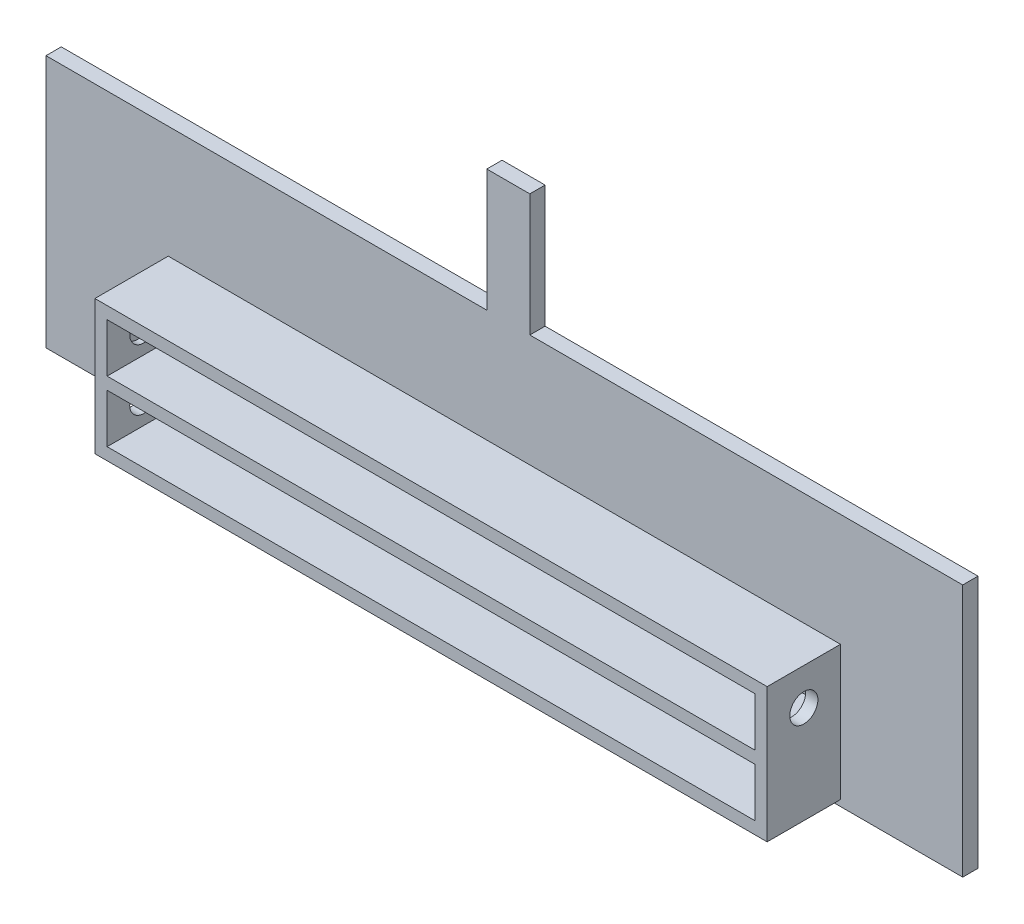
ISO-10303-21;
HEADER;
FILE_DESCRIPTION(('STEP AP214'),'2;1');
FILE_NAME('part.step','',(''),(''),'','','');
FILE_SCHEMA(('AUTOMOTIVE_DESIGN { 1 0 10303 214 1 1 1 1 }'));
ENDSEC;
DATA;
#1=APPLICATION_CONTEXT('core data for automotive mechanical design processes');
#2=APPLICATION_PROTOCOL_DEFINITION('international standard','automotive_design',2000,#1);
#3=PRODUCT_CONTEXT('',#1,'mechanical');
#4=PRODUCT('Part','Part','',(#3));
#5=PRODUCT_RELATED_PRODUCT_CATEGORY('part','',(#4));
#6=PRODUCT_DEFINITION_FORMATION('','',#4);
#7=PRODUCT_DEFINITION_CONTEXT('part definition',#1,'design');
#8=PRODUCT_DEFINITION('design','',#6,#7);
#9=PRODUCT_DEFINITION_SHAPE('','',#8);
#10=(LENGTH_UNIT() NAMED_UNIT(*) SI_UNIT(.MILLI.,.METRE.));
#11=(NAMED_UNIT(*) PLANE_ANGLE_UNIT() SI_UNIT($,.RADIAN.));
#12=(NAMED_UNIT(*) SI_UNIT($,.STERADIAN.) SOLID_ANGLE_UNIT());
#13=UNCERTAINTY_MEASURE_WITH_UNIT(LENGTH_MEASURE(1.E-05),#10,'distance_accuracy_value','');
#14=(GEOMETRIC_REPRESENTATION_CONTEXT(3) GLOBAL_UNCERTAINTY_ASSIGNED_CONTEXT((#13)) GLOBAL_UNIT_ASSIGNED_CONTEXT((#10,
#11,#12)) REPRESENTATION_CONTEXT('',''));
#15=CARTESIAN_POINT('',(0.,0.,0.));
#16=DIRECTION('',(0.,0.,1.));
#17=DIRECTION('',(1.,0.,0.));
#18=AXIS2_PLACEMENT_3D('',#15,#16,#17);
#19=CARTESIAN_POINT('',(-75.,29.41,2.5));
#20=DIRECTION('',(0.,-1.,0.));
#21=DIRECTION('',(0.,0.,-1.));
#22=AXIS2_PLACEMENT_3D('',#19,#20,#21);
#23=PLANE('',#22);
#24=DIRECTION('',(0.,0.,1.));
#25=VECTOR('',#24,1.);
#26=CARTESIAN_POINT('',(-2.87482082794567,29.41,0.));
#27=LINE('',#26,#25);
#28=CARTESIAN_POINT('',(-2.87482082794567,29.41,0.));
#29=VERTEX_POINT('',#28);
#30=CARTESIAN_POINT('',(-2.87482082794567,29.41,2.5));
#31=VERTEX_POINT('',#30);
#32=EDGE_CURVE('E196',#29,#31,#27,.T.);
#33=ORIENTED_EDGE('',*,*,#32,.F.);
#34=DIRECTION('',(-1.,0.,0.));
#35=VECTOR('',#34,1.);
#36=CARTESIAN_POINT('',(-75.,29.41,0.));
#37=LINE('',#36,#35);
#38=CARTESIAN_POINT('',(-75.,29.41,0.));
#39=VERTEX_POINT('',#38);
#40=EDGE_CURVE('E327',#29,#39,#37,.T.);
#41=ORIENTED_EDGE('',*,*,#40,.T.);
#42=DIRECTION('',(0.,0.,-1.));
#43=VECTOR('',#42,1.);
#44=CARTESIAN_POINT('',(-75.,29.41,2.5));
#45=LINE('',#44,#43);
#46=CARTESIAN_POINT('',(-75.,29.41,2.5));
#47=VERTEX_POINT('',#46);
#48=EDGE_CURVE('E320',#47,#39,#45,.T.);
#49=ORIENTED_EDGE('',*,*,#48,.F.);
#50=DIRECTION('',(-1.,0.,0.));
#51=VECTOR('',#50,1.);
#52=CARTESIAN_POINT('',(-75.,29.41,2.5));
#53=LINE('',#52,#51);
#54=EDGE_CURVE('E50',#31,#47,#53,.T.);
#55=ORIENTED_EDGE('',*,*,#54,.F.);
#56=EDGE_LOOP('',(#33,#41,#49,#55));
#57=FACE_BOUND('',#56,.T.);
#58=ADVANCED_FACE('F33',(#57),#23,.F.);
#59=DIRECTION('',(0.,0.,-1.));
#60=VECTOR('',#59,1.);
#61=CARTESIAN_POINT('',(4.16522285933797,29.41,0.));
#62=LINE('',#61,#60);
#63=CARTESIAN_POINT('',(4.16522285933797,29.41,2.5));
#64=VERTEX_POINT('',#63);
#65=CARTESIAN_POINT('',(4.16522285933797,29.41,0.));
#66=VERTEX_POINT('',#65);
#67=EDGE_CURVE('E58',#64,#66,#62,.T.);
#68=ORIENTED_EDGE('',*,*,#67,.F.);
#69=CARTESIAN_POINT('',(75.,29.41,2.5));
#70=VERTEX_POINT('',#69);
#71=EDGE_CURVE('E318',#70,#64,#53,.T.);
#72=ORIENTED_EDGE('',*,*,#71,.F.);
#73=DIRECTION('',(0.,0.,-1.));
#74=VECTOR('',#73,1.);
#75=CARTESIAN_POINT('',(75.,29.41,2.5));
#76=LINE('',#75,#74);
#77=CARTESIAN_POINT('',(75.,29.41,0.));
#78=VERTEX_POINT('',#77);
#79=EDGE_CURVE('E331',#70,#78,#76,.T.);
#80=ORIENTED_EDGE('',*,*,#79,.T.);
#81=EDGE_CURVE('E314',#78,#66,#37,.T.);
#82=ORIENTED_EDGE('',*,*,#81,.T.);
#83=EDGE_LOOP('',(#68,#72,#80,#82));
#84=FACE_BOUND('',#83,.T.);
#85=ADVANCED_FACE('F381',(#84),#23,.F.);
#86=CARTESIAN_POINT('',(0.,0.,14.5));
#87=DIRECTION('',(0.,0.,1.));
#88=DIRECTION('',(1.,0.,0.));
#89=AXIS2_PLACEMENT_3D('',#86,#87,#88);
#90=PLANE('',#89);
#91=DIRECTION('',(0.,-1.,0.));
#92=VECTOR('',#91,1.);
#93=CARTESIAN_POINT('',(-55.,11.,14.5));
#94=LINE('',#93,#92);
#95=CARTESIAN_POINT('',(-55.,11.,14.5));
#96=VERTEX_POINT('',#95);
#97=CARTESIAN_POINT('',(-55.,-11.,14.5));
#98=VERTEX_POINT('',#97);
#99=EDGE_CURVE('E282',#96,#98,#94,.T.);
#100=ORIENTED_EDGE('',*,*,#99,.T.);
#101=DIRECTION('',(1.,0.,0.));
#102=VECTOR('',#101,1.);
#103=CARTESIAN_POINT('',(-55.,-11.,14.5));
#104=LINE('',#103,#102);
#105=CARTESIAN_POINT('',(55.,-11.,14.5));
#106=VERTEX_POINT('',#105);
#107=EDGE_CURVE('E285',#98,#106,#104,.T.);
#108=ORIENTED_EDGE('',*,*,#107,.T.);
#109=DIRECTION('',(0.,1.,0.));
#110=VECTOR('',#109,1.);
#111=CARTESIAN_POINT('',(55.,11.,14.5));
#112=LINE('',#111,#110);
#113=CARTESIAN_POINT('',(55.,11.,14.5));
#114=VERTEX_POINT('',#113);
#115=EDGE_CURVE('E288',#106,#114,#112,.T.);
#116=ORIENTED_EDGE('',*,*,#115,.T.);
#117=DIRECTION('',(-1.,0.,0.));
#118=VECTOR('',#117,1.);
#119=CARTESIAN_POINT('',(-55.,11.,14.5));
#120=LINE('',#119,#118);
#121=EDGE_CURVE('E290',#114,#96,#120,.T.);
#122=ORIENTED_EDGE('',*,*,#121,.T.);
#123=EDGE_LOOP('',(#100,#108,#116,#122));
#124=FACE_BOUND('',#123,.T.);
#125=DIRECTION('',(1.,0.,0.));
#126=VECTOR('',#125,1.);
#127=CARTESIAN_POINT('',(-53.,-9.,14.5));
#128=LINE('',#127,#126);
#129=CARTESIAN_POINT('',(-53.,-9.,14.5));
#130=VERTEX_POINT('',#129);
#131=CARTESIAN_POINT('',(53.,-9.,14.5));
#132=VERTEX_POINT('',#131);
#133=EDGE_CURVE('E256',#130,#132,#128,.T.);
#134=ORIENTED_EDGE('',*,*,#133,.F.);
#135=DIRECTION('',(0.,-1.,0.));
#136=VECTOR('',#135,1.);
#137=CARTESIAN_POINT('',(-53.,-1.,14.5));
#138=LINE('',#137,#136);
#139=CARTESIAN_POINT('',(-53.,-1.,14.5));
#140=VERTEX_POINT('',#139);
#141=EDGE_CURVE('E254',#140,#130,#138,.T.);
#142=ORIENTED_EDGE('',*,*,#141,.F.);
#143=DIRECTION('',(-1.,0.,0.));
#144=VECTOR('',#143,1.);
#145=CARTESIAN_POINT('',(-53.,-1.,14.5));
#146=LINE('',#145,#144);
#147=CARTESIAN_POINT('',(53.,-1.,14.5));
#148=VERTEX_POINT('',#147);
#149=EDGE_CURVE('E262',#148,#140,#146,.T.);
#150=ORIENTED_EDGE('',*,*,#149,.F.);
#151=DIRECTION('',(0.,1.,0.));
#152=VECTOR('',#151,1.);
#153=CARTESIAN_POINT('',(53.,-1.,14.5));
#154=LINE('',#153,#152);
#155=EDGE_CURVE('E259',#132,#148,#154,.T.);
#156=ORIENTED_EDGE('',*,*,#155,.F.);
#157=EDGE_LOOP('',(#134,#142,#150,#156));
#158=FACE_BOUND('',#157,.T.);
#159=DIRECTION('',(1.,0.,0.));
#160=VECTOR('',#159,1.);
#161=CARTESIAN_POINT('',(-53.,1.,14.5));
#162=LINE('',#161,#160);
#163=CARTESIAN_POINT('',(-53.,1.,14.5));
#164=VERTEX_POINT('',#163);
#165=CARTESIAN_POINT('',(53.,1.,14.5));
#166=VERTEX_POINT('',#165);
#167=EDGE_CURVE('E224',#164,#166,#162,.T.);
#168=ORIENTED_EDGE('',*,*,#167,.F.);
#169=DIRECTION('',(0.,-1.,0.));
#170=VECTOR('',#169,1.);
#171=CARTESIAN_POINT('',(-53.,9.,14.5));
#172=LINE('',#171,#170);
#173=CARTESIAN_POINT('',(-53.,9.,14.5));
#174=VERTEX_POINT('',#173);
#175=EDGE_CURVE('E222',#174,#164,#172,.T.);
#176=ORIENTED_EDGE('',*,*,#175,.F.);
#177=DIRECTION('',(-1.,0.,0.));
#178=VECTOR('',#177,1.);
#179=CARTESIAN_POINT('',(-53.,9.,14.5));
#180=LINE('',#179,#178);
#181=CARTESIAN_POINT('',(53.,9.,14.5));
#182=VERTEX_POINT('',#181);
#183=EDGE_CURVE('E230',#182,#174,#180,.T.);
#184=ORIENTED_EDGE('',*,*,#183,.F.);
#185=DIRECTION('',(0.,1.,0.));
#186=VECTOR('',#185,1.);
#187=CARTESIAN_POINT('',(53.,9.,14.5));
#188=LINE('',#187,#186);
#189=EDGE_CURVE('E227',#166,#182,#188,.T.);
#190=ORIENTED_EDGE('',*,*,#189,.F.);
#191=EDGE_LOOP('',(#168,#176,#184,#190));
#192=FACE_BOUND('',#191,.T.);
#193=ADVANCED_FACE('F359',(#124,#158,#192),#90,.T.);
#194=CARTESIAN_POINT('',(0.,0.,2.5));
#195=DIRECTION('',(0.,0.,1.));
#196=DIRECTION('',(1.,0.,0.));
#197=AXIS2_PLACEMENT_3D('',#194,#195,#196);
#198=PLANE('',#197);
#199=DIRECTION('',(0.,-1.,0.));
#200=VECTOR('',#199,1.);
#201=CARTESIAN_POINT('',(-75.,29.41,2.5));
#202=LINE('',#201,#200);
#203=CARTESIAN_POINT('',(-75.,-12.,2.5));
#204=VERTEX_POINT('',#203);
#205=EDGE_CURVE('E311',#47,#204,#202,.T.);
#206=ORIENTED_EDGE('',*,*,#205,.T.);
#207=DIRECTION('',(1.,0.,0.));
#208=VECTOR('',#207,1.);
#209=CARTESIAN_POINT('',(-75.,-12.,2.5));
#210=LINE('',#209,#208);
#211=CARTESIAN_POINT('',(75.,-12.,2.5));
#212=VERTEX_POINT('',#211);
#213=EDGE_CURVE('E313',#204,#212,#210,.T.);
#214=ORIENTED_EDGE('',*,*,#213,.T.);
#215=DIRECTION('',(0.,1.,0.));
#216=VECTOR('',#215,1.);
#217=CARTESIAN_POINT('',(75.,29.41,2.5));
#218=LINE('',#217,#216);
#219=EDGE_CURVE('E316',#212,#70,#218,.T.);
#220=ORIENTED_EDGE('',*,*,#219,.T.);
#221=ORIENTED_EDGE('',*,*,#71,.T.);
#222=DIRECTION('',(0.,-1.,0.));
#223=VECTOR('',#222,1.);
#224=CARTESIAN_POINT('',(4.16522285933797,49.41,2.5));
#225=LINE('',#224,#223);
#226=CARTESIAN_POINT('',(4.16522285933797,49.41,2.5));
#227=VERTEX_POINT('',#226);
#228=EDGE_CURVE('E181',#227,#64,#225,.T.);
#229=ORIENTED_EDGE('',*,*,#228,.F.);
#230=DIRECTION('',(1.,0.,0.));
#231=VECTOR('',#230,1.);
#232=CARTESIAN_POINT('',(-2.87482082794567,49.41,2.5));
#233=LINE('',#232,#231);
#234=CARTESIAN_POINT('',(-2.87482082794567,49.41,2.5));
#235=VERTEX_POINT('',#234);
#236=EDGE_CURVE('E172',#235,#227,#233,.T.);
#237=ORIENTED_EDGE('',*,*,#236,.F.);
#238=DIRECTION('',(0.,-1.,0.));
#239=VECTOR('',#238,1.);
#240=CARTESIAN_POINT('',(-2.87482082794567,49.41,2.5));
#241=LINE('',#240,#239);
#242=EDGE_CURVE('E178',#235,#31,#241,.T.);
#243=ORIENTED_EDGE('',*,*,#242,.T.);
#244=ORIENTED_EDGE('',*,*,#54,.T.);
#245=EDGE_LOOP('',(#206,#214,#220,#221,#229,#237,#243,#244));
#246=FACE_BOUND('',#245,.T.);
#247=DIRECTION('',(1.,0.,0.));
#248=VECTOR('',#247,1.);
#249=CARTESIAN_POINT('',(-55.,-11.,2.5));
#250=LINE('',#249,#248);
#251=CARTESIAN_POINT('',(-55.,-11.,2.5));
#252=VERTEX_POINT('',#251);
#253=CARTESIAN_POINT('',(55.,-11.,2.5));
#254=VERTEX_POINT('',#253);
#255=EDGE_CURVE('E295',#252,#254,#250,.T.);
#256=ORIENTED_EDGE('',*,*,#255,.F.);
#257=DIRECTION('',(0.,-1.,0.));
#258=VECTOR('',#257,1.);
#259=CARTESIAN_POINT('',(-55.,11.,2.5));
#260=LINE('',#259,#258);
#261=CARTESIAN_POINT('',(-55.,11.,2.5));
#262=VERTEX_POINT('',#261);
#263=EDGE_CURVE('E253',#262,#252,#260,.T.);
#264=ORIENTED_EDGE('',*,*,#263,.F.);
#265=DIRECTION('',(-1.,0.,0.));
#266=VECTOR('',#265,1.);
#267=CARTESIAN_POINT('',(-55.,11.,2.5));
#268=LINE('',#267,#266);
#269=CARTESIAN_POINT('',(55.,11.,2.5));
#270=VERTEX_POINT('',#269);
#271=EDGE_CURVE('E286',#270,#262,#268,.T.);
#272=ORIENTED_EDGE('',*,*,#271,.F.);
#273=DIRECTION('',(0.,1.,0.));
#274=VECTOR('',#273,1.);
#275=CARTESIAN_POINT('',(55.,11.,2.5));
#276=LINE('',#275,#274);
#277=EDGE_CURVE('E297',#254,#270,#276,.T.);
#278=ORIENTED_EDGE('',*,*,#277,.F.);
#279=EDGE_LOOP('',(#256,#264,#272,#278));
#280=FACE_BOUND('',#279,.T.);
#281=ADVANCED_FACE('F175',(#246,#280),#198,.T.);
#282=CARTESIAN_POINT('',(-75.,29.41,2.5));
#283=DIRECTION('',(1.,0.,0.));
#284=DIRECTION('',(0.,0.,-1.));
#285=AXIS2_PLACEMENT_3D('',#282,#283,#284);
#286=PLANE('',#285);
#287=DIRECTION('',(0.,-1.,0.));
#288=VECTOR('',#287,1.);
#289=CARTESIAN_POINT('',(-75.,29.41,0.));
#290=LINE('',#289,#288);
#291=CARTESIAN_POINT('',(-75.,-12.,0.));
#292=VERTEX_POINT('',#291);
#293=EDGE_CURVE('E310',#39,#292,#290,.T.);
#294=ORIENTED_EDGE('',*,*,#293,.T.);
#295=DIRECTION('',(0.,0.,-1.));
#296=VECTOR('',#295,1.);
#297=CARTESIAN_POINT('',(-75.,-12.,2.5));
#298=LINE('',#297,#296);
#299=EDGE_CURVE('E11',#204,#292,#298,.T.);
#300=ORIENTED_EDGE('',*,*,#299,.F.);
#301=ORIENTED_EDGE('',*,*,#205,.F.);
#302=ORIENTED_EDGE('',*,*,#48,.T.);
#303=EDGE_LOOP('',(#294,#300,#301,#302));
#304=FACE_BOUND('',#303,.T.);
#305=ADVANCED_FACE('F35',(#304),#286,.F.);
#306=CARTESIAN_POINT('',(-75.,-12.,2.5));
#307=DIRECTION('',(0.,1.,0.));
#308=DIRECTION('',(0.,0.,1.));
#309=AXIS2_PLACEMENT_3D('',#306,#307,#308);
#310=PLANE('',#309);
#311=DIRECTION('',(1.,0.,0.));
#312=VECTOR('',#311,1.);
#313=CARTESIAN_POINT('',(-75.,-12.,0.));
#314=LINE('',#313,#312);
#315=CARTESIAN_POINT('',(75.,-12.,0.));
#316=VERTEX_POINT('',#315);
#317=EDGE_CURVE('E323',#292,#316,#314,.T.);
#318=ORIENTED_EDGE('',*,*,#317,.T.);
#319=DIRECTION('',(0.,0.,-1.));
#320=VECTOR('',#319,1.);
#321=CARTESIAN_POINT('',(75.,-12.,2.5));
#322=LINE('',#321,#320);
#323=EDGE_CURVE('E42',#212,#316,#322,.T.);
#324=ORIENTED_EDGE('',*,*,#323,.F.);
#325=ORIENTED_EDGE('',*,*,#213,.F.);
#326=ORIENTED_EDGE('',*,*,#299,.T.);
#327=EDGE_LOOP('',(#318,#324,#325,#326));
#328=FACE_BOUND('',#327,.T.);
#329=ADVANCED_FACE('F393',(#328),#310,.F.);
#330=CARTESIAN_POINT('',(75.,29.41,2.5));
#331=DIRECTION('',(-1.,0.,0.));
#332=DIRECTION('',(0.,0.,1.));
#333=AXIS2_PLACEMENT_3D('',#330,#331,#332);
#334=PLANE('',#333);
#335=DIRECTION('',(0.,1.,0.));
#336=VECTOR('',#335,1.);
#337=CARTESIAN_POINT('',(75.,29.41,0.));
#338=LINE('',#337,#336);
#339=EDGE_CURVE('E325',#316,#78,#338,.T.);
#340=ORIENTED_EDGE('',*,*,#339,.T.);
#341=ORIENTED_EDGE('',*,*,#79,.F.);
#342=ORIENTED_EDGE('',*,*,#219,.F.);
#343=ORIENTED_EDGE('',*,*,#323,.T.);
#344=EDGE_LOOP('',(#340,#341,#342,#343));
#345=FACE_BOUND('',#344,.T.);
#346=ADVANCED_FACE('F391',(#345),#334,.F.);
#347=CARTESIAN_POINT('',(0.,0.,0.));
#348=DIRECTION('',(0.,0.,1.));
#349=DIRECTION('',(1.,0.,0.));
#350=AXIS2_PLACEMENT_3D('',#347,#348,#349);
#351=PLANE('',#350);
#352=ORIENTED_EDGE('',*,*,#293,.F.);
#353=ORIENTED_EDGE('',*,*,#40,.F.);
#354=DIRECTION('',(0.,-1.,0.));
#355=VECTOR('',#354,1.);
#356=CARTESIAN_POINT('',(-2.87482082794567,49.41,0.));
#357=LINE('',#356,#355);
#358=CARTESIAN_POINT('',(-2.87482082794567,49.41,0.));
#359=VERTEX_POINT('',#358);
#360=EDGE_CURVE('E417',#359,#29,#357,.T.);
#361=ORIENTED_EDGE('',*,*,#360,.F.);
#362=DIRECTION('',(-1.,0.,0.));
#363=VECTOR('',#362,1.);
#364=CARTESIAN_POINT('',(-2.87482082794567,49.41,0.));
#365=LINE('',#364,#363);
#366=CARTESIAN_POINT('',(4.16522285933797,49.41,0.));
#367=VERTEX_POINT('',#366);
#368=EDGE_CURVE('E190',#367,#359,#365,.T.);
#369=ORIENTED_EDGE('',*,*,#368,.F.);
#370=DIRECTION('',(0.,-1.,0.));
#371=VECTOR('',#370,1.);
#372=CARTESIAN_POINT('',(4.16522285933797,49.41,0.));
#373=LINE('',#372,#371);
#374=EDGE_CURVE('E202',#367,#66,#373,.T.);
#375=ORIENTED_EDGE('',*,*,#374,.T.);
#376=ORIENTED_EDGE('',*,*,#81,.F.);
#377=ORIENTED_EDGE('',*,*,#339,.F.);
#378=ORIENTED_EDGE('',*,*,#317,.F.);
#379=EDGE_LOOP('',(#352,#353,#361,#369,#375,#376,#377,#378));
#380=FACE_BOUND('',#379,.T.);
#381=ADVANCED_FACE('F389',(#380),#351,.F.);
#382=CARTESIAN_POINT('',(-55.,11.,14.5));
#383=DIRECTION('',(1.,0.,0.));
#384=DIRECTION('',(0.,0.,-1.));
#385=AXIS2_PLACEMENT_3D('',#382,#383,#384);
#386=PLANE('',#385);
#387=CARTESIAN_POINT('',(-55.,-4.99999999999999,8.5));
#388=DIRECTION('',(-1.,0.,0.));
#389=DIRECTION('',(0.,0.,1.));
#390=AXIS2_PLACEMENT_3D('',#387,#388,#389);
#391=CIRCLE('',#390,2.3);
#392=CARTESIAN_POINT('',(-55.,-4.99999999999999,10.8));
#393=VERTEX_POINT('',#392);
#394=EDGE_CURVE('E211',#393,#393,#391,.T.);
#395=ORIENTED_EDGE('',*,*,#394,.F.);
#396=EDGE_LOOP('',(#395));
#397=FACE_BOUND('',#396,.T.);
#398=ORIENTED_EDGE('',*,*,#263,.T.);
#399=DIRECTION('',(0.,0.,-1.));
#400=VECTOR('',#399,1.);
#401=CARTESIAN_POINT('',(-55.,-11.,14.5));
#402=LINE('',#401,#400);
#403=EDGE_CURVE('E308',#98,#252,#402,.T.);
#404=ORIENTED_EDGE('',*,*,#403,.F.);
#405=ORIENTED_EDGE('',*,*,#99,.F.);
#406=DIRECTION('',(0.,0.,-1.));
#407=VECTOR('',#406,1.);
#408=CARTESIAN_POINT('',(-55.,11.,14.5));
#409=LINE('',#408,#407);
#410=EDGE_CURVE('E292',#96,#262,#409,.T.);
#411=ORIENTED_EDGE('',*,*,#410,.T.);
#412=EDGE_LOOP('',(#398,#404,#405,#411));
#413=FACE_BOUND('',#412,.T.);
#414=ADVANCED_FACE('F546',(#397,#413),#386,.F.);
#415=CARTESIAN_POINT('',(-55.,-11.,14.5));
#416=DIRECTION('',(0.,1.,0.));
#417=DIRECTION('',(-1.,0.,0.));
#418=AXIS2_PLACEMENT_3D('',#415,#416,#417);
#419=PLANE('',#418);
#420=ORIENTED_EDGE('',*,*,#255,.T.);
#421=DIRECTION('',(0.,0.,-1.));
#422=VECTOR('',#421,1.);
#423=CARTESIAN_POINT('',(55.,-11.,14.5));
#424=LINE('',#423,#422);
#425=EDGE_CURVE('E305',#106,#254,#424,.T.);
#426=ORIENTED_EDGE('',*,*,#425,.F.);
#427=ORIENTED_EDGE('',*,*,#107,.F.);
#428=ORIENTED_EDGE('',*,*,#403,.T.);
#429=EDGE_LOOP('',(#420,#426,#427,#428));
#430=FACE_BOUND('',#429,.T.);
#431=ADVANCED_FACE('F581',(#430),#419,.F.);
#432=CARTESIAN_POINT('',(55.,11.,14.5));
#433=DIRECTION('',(-1.,0.,0.));
#434=DIRECTION('',(0.,0.,1.));
#435=AXIS2_PLACEMENT_3D('',#432,#433,#434);
#436=PLANE('',#435);
#437=CARTESIAN_POINT('',(55.,5.,8.5));
#438=DIRECTION('',(1.,0.,0.));
#439=DIRECTION('',(0.,0.,-1.));
#440=AXIS2_PLACEMENT_3D('',#437,#438,#439);
#441=CIRCLE('',#440,2.3);
#442=CARTESIAN_POINT('',(55.,5.,6.2));
#443=VERTEX_POINT('',#442);
#444=EDGE_CURVE('E197',#443,#443,#441,.T.);
#445=ORIENTED_EDGE('',*,*,#444,.F.);
#446=EDGE_LOOP('',(#445));
#447=FACE_BOUND('',#446,.T.);
#448=ORIENTED_EDGE('',*,*,#277,.T.);
#449=DIRECTION('',(0.,0.,-1.));
#450=VECTOR('',#449,1.);
#451=CARTESIAN_POINT('',(55.,11.,14.5));
#452=LINE('',#451,#450);
#453=EDGE_CURVE('E303',#114,#270,#452,.T.);
#454=ORIENTED_EDGE('',*,*,#453,.F.);
#455=ORIENTED_EDGE('',*,*,#115,.F.);
#456=ORIENTED_EDGE('',*,*,#425,.T.);
#457=EDGE_LOOP('',(#448,#454,#455,#456));
#458=FACE_BOUND('',#457,.T.);
#459=ADVANCED_FACE('F375',(#447,#458),#436,.F.);
#460=CARTESIAN_POINT('',(-55.,11.,14.5));
#461=DIRECTION('',(0.,-1.,0.));
#462=DIRECTION('',(0.,0.,-1.));
#463=AXIS2_PLACEMENT_3D('',#460,#461,#462);
#464=PLANE('',#463);
#465=ORIENTED_EDGE('',*,*,#271,.T.);
#466=ORIENTED_EDGE('',*,*,#410,.F.);
#467=ORIENTED_EDGE('',*,*,#121,.F.);
#468=ORIENTED_EDGE('',*,*,#453,.T.);
#469=EDGE_LOOP('',(#465,#466,#467,#468));
#470=FACE_BOUND('',#469,.T.);
#471=ADVANCED_FACE('F367',(#470),#464,.F.);
#472=CARTESIAN_POINT('',(-53.,-1.,14.5));
#473=DIRECTION('',(1.,0.,0.));
#474=DIRECTION('',(0.,0.,-1.));
#475=AXIS2_PLACEMENT_3D('',#472,#473,#474);
#476=PLANE('',#475);
#477=CARTESIAN_POINT('',(-53.,-4.99999999999999,8.5));
#478=DIRECTION('',(1.,0.,0.));
#479=DIRECTION('',(0.,0.,-1.));
#480=AXIS2_PLACEMENT_3D('',#477,#478,#479);
#481=CIRCLE('',#480,2.3);
#482=CARTESIAN_POINT('',(-53.,-4.99999999999999,6.2));
#483=VERTEX_POINT('',#482);
#484=EDGE_CURVE('E218',#483,#483,#481,.T.);
#485=ORIENTED_EDGE('',*,*,#484,.F.);
#486=EDGE_LOOP('',(#485));
#487=FACE_BOUND('',#486,.T.);
#488=DIRECTION('',(0.,-1.,0.));
#489=VECTOR('',#488,1.);
#490=CARTESIAN_POINT('',(-53.,-1.,2.5));
#491=LINE('',#490,#489);
#492=CARTESIAN_POINT('',(-53.,-1.,2.5));
#493=VERTEX_POINT('',#492);
#494=CARTESIAN_POINT('',(-53.,-9.,2.5));
#495=VERTEX_POINT('',#494);
#496=EDGE_CURVE('E221',#493,#495,#491,.T.);
#497=ORIENTED_EDGE('',*,*,#496,.F.);
#498=DIRECTION('',(0.,0.,-1.));
#499=VECTOR('',#498,1.);
#500=CARTESIAN_POINT('',(-53.,-1.,14.5));
#501=LINE('',#500,#499);
#502=EDGE_CURVE('E264',#140,#493,#501,.T.);
#503=ORIENTED_EDGE('',*,*,#502,.F.);
#504=ORIENTED_EDGE('',*,*,#141,.T.);
#505=DIRECTION('',(0.,0.,-1.));
#506=VECTOR('',#505,1.);
#507=CARTESIAN_POINT('',(-53.,-9.,14.5));
#508=LINE('',#507,#506);
#509=EDGE_CURVE('E237',#130,#495,#508,.T.);
#510=ORIENTED_EDGE('',*,*,#509,.T.);
#511=EDGE_LOOP('',(#497,#503,#504,#510));
#512=FACE_BOUND('',#511,.T.);
#513=ADVANCED_FACE('F365',(#487,#512),#476,.T.);
#514=CARTESIAN_POINT('',(-53.,-9.,14.5));
#515=DIRECTION('',(0.,1.,0.));
#516=DIRECTION('',(0.,0.,1.));
#517=AXIS2_PLACEMENT_3D('',#514,#515,#516);
#518=PLANE('',#517);
#519=DIRECTION('',(1.,0.,0.));
#520=VECTOR('',#519,1.);
#521=CARTESIAN_POINT('',(-53.,-9.,2.5));
#522=LINE('',#521,#520);
#523=CARTESIAN_POINT('',(53.,-9.,2.5));
#524=VERTEX_POINT('',#523);
#525=EDGE_CURVE('E267',#495,#524,#522,.T.);
#526=ORIENTED_EDGE('',*,*,#525,.F.);
#527=ORIENTED_EDGE('',*,*,#509,.F.);
#528=ORIENTED_EDGE('',*,*,#133,.T.);
#529=DIRECTION('',(0.,0.,-1.));
#530=VECTOR('',#529,1.);
#531=CARTESIAN_POINT('',(53.,-9.,14.5));
#532=LINE('',#531,#530);
#533=EDGE_CURVE('E277',#132,#524,#532,.T.);
#534=ORIENTED_EDGE('',*,*,#533,.T.);
#535=EDGE_LOOP('',(#526,#527,#528,#534));
#536=FACE_BOUND('',#535,.T.);
#537=ADVANCED_FACE('F345',(#536),#518,.T.);
#538=CARTESIAN_POINT('',(53.,-1.,14.5));
#539=DIRECTION('',(-1.,0.,0.));
#540=DIRECTION('',(0.,0.,1.));
#541=AXIS2_PLACEMENT_3D('',#538,#539,#540);
#542=PLANE('',#541);
#543=CARTESIAN_POINT('',(53.,-4.99999999999999,8.5));
#544=DIRECTION('',(-1.,0.,0.));
#545=DIRECTION('',(0.,0.,1.));
#546=AXIS2_PLACEMENT_3D('',#543,#544,#545);
#547=CIRCLE('',#546,2.3);
#548=CARTESIAN_POINT('',(53.,-4.99999999999999,10.8));
#549=VERTEX_POINT('',#548);
#550=EDGE_CURVE('E215',#549,#549,#547,.T.);
#551=ORIENTED_EDGE('',*,*,#550,.F.);
#552=EDGE_LOOP('',(#551));
#553=FACE_BOUND('',#552,.T.);
#554=DIRECTION('',(0.,1.,0.));
#555=VECTOR('',#554,1.);
#556=CARTESIAN_POINT('',(53.,-1.,2.5));
#557=LINE('',#556,#555);
#558=CARTESIAN_POINT('',(53.,-1.,2.5));
#559=VERTEX_POINT('',#558);
#560=EDGE_CURVE('E269',#524,#559,#557,.T.);
#561=ORIENTED_EDGE('',*,*,#560,.F.);
#562=ORIENTED_EDGE('',*,*,#533,.F.);
#563=ORIENTED_EDGE('',*,*,#155,.T.);
#564=DIRECTION('',(0.,0.,-1.));
#565=VECTOR('',#564,1.);
#566=CARTESIAN_POINT('',(53.,-1.,14.5));
#567=LINE('',#566,#565);
#568=EDGE_CURVE('E274',#148,#559,#567,.T.);
#569=ORIENTED_EDGE('',*,*,#568,.T.);
#570=EDGE_LOOP('',(#561,#562,#563,#569));
#571=FACE_BOUND('',#570,.T.);
#572=ADVANCED_FACE('F341',(#553,#571),#542,.T.);
#573=CARTESIAN_POINT('',(-53.,-1.,14.5));
#574=DIRECTION('',(0.,-1.,0.));
#575=DIRECTION('',(0.,0.,-1.));
#576=AXIS2_PLACEMENT_3D('',#573,#574,#575);
#577=PLANE('',#576);
#578=DIRECTION('',(-1.,0.,0.));
#579=VECTOR('',#578,1.);
#580=CARTESIAN_POINT('',(-53.,-1.,2.5));
#581=LINE('',#580,#579);
#582=EDGE_CURVE('E257',#559,#493,#581,.T.);
#583=ORIENTED_EDGE('',*,*,#582,.F.);
#584=ORIENTED_EDGE('',*,*,#568,.F.);
#585=ORIENTED_EDGE('',*,*,#149,.T.);
#586=ORIENTED_EDGE('',*,*,#502,.T.);
#587=EDGE_LOOP('',(#583,#584,#585,#586));
#588=FACE_BOUND('',#587,.T.);
#589=ADVANCED_FACE('F344',(#588),#577,.T.);
#590=CARTESIAN_POINT('',(0.,0.,2.5));
#591=DIRECTION('',(0.,0.,1.));
#592=DIRECTION('',(1.,0.,0.));
#593=AXIS2_PLACEMENT_3D('',#590,#591,#592);
#594=PLANE('',#593);
#595=ORIENTED_EDGE('',*,*,#496,.T.);
#596=ORIENTED_EDGE('',*,*,#525,.T.);
#597=ORIENTED_EDGE('',*,*,#560,.T.);
#598=ORIENTED_EDGE('',*,*,#582,.T.);
#599=EDGE_LOOP('',(#595,#596,#597,#598));
#600=FACE_BOUND('',#599,.T.);
#601=ADVANCED_FACE('F352',(#600),#594,.T.);
#602=CARTESIAN_POINT('',(-53.,9.,14.5));
#603=DIRECTION('',(1.,0.,0.));
#604=DIRECTION('',(0.,0.,-1.));
#605=AXIS2_PLACEMENT_3D('',#602,#603,#604);
#606=PLANE('',#605);
#607=CARTESIAN_POINT('',(-53.,5.,8.5));
#608=DIRECTION('',(1.,0.,0.));
#609=DIRECTION('',(0.,0.,-1.));
#610=AXIS2_PLACEMENT_3D('',#607,#608,#609);
#611=CIRCLE('',#610,2.3);
#612=CARTESIAN_POINT('',(-53.,5.,6.2));
#613=VERTEX_POINT('',#612);
#614=EDGE_CURVE('E208',#613,#613,#611,.T.);
#615=ORIENTED_EDGE('',*,*,#614,.F.);
#616=EDGE_LOOP('',(#615));
#617=FACE_BOUND('',#616,.T.);
#618=DIRECTION('',(0.,-1.,0.));
#619=VECTOR('',#618,1.);
#620=CARTESIAN_POINT('',(-53.,9.,2.5));
#621=LINE('',#620,#619);
#622=CARTESIAN_POINT('',(-53.,9.,2.5));
#623=VERTEX_POINT('',#622);
#624=CARTESIAN_POINT('',(-53.,1.,2.5));
#625=VERTEX_POINT('',#624);
#626=EDGE_CURVE('E233',#623,#625,#621,.T.);
#627=ORIENTED_EDGE('',*,*,#626,.F.);
#628=DIRECTION('',(0.,0.,-1.));
#629=VECTOR('',#628,1.);
#630=CARTESIAN_POINT('',(-53.,9.,14.5));
#631=LINE('',#630,#629);
#632=EDGE_CURVE('E232',#174,#623,#631,.T.);
#633=ORIENTED_EDGE('',*,*,#632,.F.);
#634=ORIENTED_EDGE('',*,*,#175,.T.);
#635=DIRECTION('',(0.,0.,-1.));
#636=VECTOR('',#635,1.);
#637=CARTESIAN_POINT('',(-53.,1.,14.5));
#638=LINE('',#637,#636);
#639=EDGE_CURVE('E250',#164,#625,#638,.T.);
#640=ORIENTED_EDGE('',*,*,#639,.T.);
#641=EDGE_LOOP('',(#627,#633,#634,#640));
#642=FACE_BOUND('',#641,.T.);
#643=ADVANCED_FACE('F461',(#617,#642),#606,.T.);
#644=CARTESIAN_POINT('',(-53.,1.,14.5));
#645=DIRECTION('',(0.,1.,0.));
#646=DIRECTION('',(0.,0.,1.));
#647=AXIS2_PLACEMENT_3D('',#644,#645,#646);
#648=PLANE('',#647);
#649=DIRECTION('',(1.,0.,0.));
#650=VECTOR('',#649,1.);
#651=CARTESIAN_POINT('',(-53.,1.,2.5));
#652=LINE('',#651,#650);
#653=CARTESIAN_POINT('',(53.,1.,2.5));
#654=VERTEX_POINT('',#653);
#655=EDGE_CURVE('E236',#625,#654,#652,.T.);
#656=ORIENTED_EDGE('',*,*,#655,.F.);
#657=ORIENTED_EDGE('',*,*,#639,.F.);
#658=ORIENTED_EDGE('',*,*,#167,.T.);
#659=DIRECTION('',(0.,0.,-1.));
#660=VECTOR('',#659,1.);
#661=CARTESIAN_POINT('',(53.,1.,14.5));
#662=LINE('',#661,#660);
#663=EDGE_CURVE('E247',#166,#654,#662,.T.);
#664=ORIENTED_EDGE('',*,*,#663,.T.);
#665=EDGE_LOOP('',(#656,#657,#658,#664));
#666=FACE_BOUND('',#665,.T.);
#667=ADVANCED_FACE('F457',(#666),#648,.T.);
#668=CARTESIAN_POINT('',(53.,9.,14.5));
#669=DIRECTION('',(-1.,0.,0.));
#670=DIRECTION('',(0.,0.,1.));
#671=AXIS2_PLACEMENT_3D('',#668,#669,#670);
#672=PLANE('',#671);
#673=CARTESIAN_POINT('',(53.,5.,8.5));
#674=DIRECTION('',(-1.,0.,0.));
#675=DIRECTION('',(0.,0.,1.));
#676=AXIS2_PLACEMENT_3D('',#673,#674,#675);
#677=CIRCLE('',#676,2.3);
#678=CARTESIAN_POINT('',(53.,5.,10.8));
#679=VERTEX_POINT('',#678);
#680=EDGE_CURVE('E37',#679,#679,#677,.T.);
#681=ORIENTED_EDGE('',*,*,#680,.F.);
#682=EDGE_LOOP('',(#681));
#683=FACE_BOUND('',#682,.T.);
#684=DIRECTION('',(0.,1.,0.));
#685=VECTOR('',#684,1.);
#686=CARTESIAN_POINT('',(53.,9.,2.5));
#687=LINE('',#686,#685);
#688=CARTESIAN_POINT('',(53.,9.,2.5));
#689=VERTEX_POINT('',#688);
#690=EDGE_CURVE('E239',#654,#689,#687,.T.);
#691=ORIENTED_EDGE('',*,*,#690,.F.);
#692=ORIENTED_EDGE('',*,*,#663,.F.);
#693=ORIENTED_EDGE('',*,*,#189,.T.);
#694=DIRECTION('',(0.,0.,-1.));
#695=VECTOR('',#694,1.);
#696=CARTESIAN_POINT('',(53.,9.,14.5));
#697=LINE('',#696,#695);
#698=EDGE_CURVE('E244',#182,#689,#697,.T.);
#699=ORIENTED_EDGE('',*,*,#698,.T.);
#700=EDGE_LOOP('',(#691,#692,#693,#699));
#701=FACE_BOUND('',#700,.T.);
#702=ADVANCED_FACE('F453',(#683,#701),#672,.T.);
#703=CARTESIAN_POINT('',(-53.,9.,14.5));
#704=DIRECTION('',(0.,-1.,0.));
#705=DIRECTION('',(0.,0.,-1.));
#706=AXIS2_PLACEMENT_3D('',#703,#704,#705);
#707=PLANE('',#706);
#708=DIRECTION('',(-1.,0.,0.));
#709=VECTOR('',#708,1.);
#710=CARTESIAN_POINT('',(-53.,9.,2.5));
#711=LINE('',#710,#709);
#712=EDGE_CURVE('E225',#689,#623,#711,.T.);
#713=ORIENTED_EDGE('',*,*,#712,.F.);
#714=ORIENTED_EDGE('',*,*,#698,.F.);
#715=ORIENTED_EDGE('',*,*,#183,.T.);
#716=ORIENTED_EDGE('',*,*,#632,.T.);
#717=EDGE_LOOP('',(#713,#714,#715,#716));
#718=FACE_BOUND('',#717,.T.);
#719=ADVANCED_FACE('F449',(#718),#707,.T.);
#720=CARTESIAN_POINT('',(0.,0.,2.5));
#721=DIRECTION('',(0.,0.,1.));
#722=DIRECTION('',(1.,0.,0.));
#723=AXIS2_PLACEMENT_3D('',#720,#721,#722);
#724=PLANE('',#723);
#725=ORIENTED_EDGE('',*,*,#626,.T.);
#726=ORIENTED_EDGE('',*,*,#655,.T.);
#727=ORIENTED_EDGE('',*,*,#690,.T.);
#728=ORIENTED_EDGE('',*,*,#712,.T.);
#729=EDGE_LOOP('',(#725,#726,#727,#728));
#730=FACE_BOUND('',#729,.T.);
#731=ADVANCED_FACE('F443',(#730),#724,.T.);
#732=CARTESIAN_POINT('',(54.,-4.99999999999999,8.5));
#733=DIRECTION('',(-1.,0.,0.));
#734=DIRECTION('',(0.,0.,1.));
#735=AXIS2_PLACEMENT_3D('',#732,#733,#734);
#736=PLANE('',#735);
#737=CARTESIAN_POINT('',(54.,-4.99999999999999,8.5));
#738=DIRECTION('',(-1.,0.,0.));
#739=DIRECTION('',(0.,0.,1.));
#740=AXIS2_PLACEMENT_3D('',#737,#738,#739);
#741=CIRCLE('',#740,2.3);
#742=CARTESIAN_POINT('',(54.,-4.99999999999999,10.8));
#743=VERTEX_POINT('',#742);
#744=EDGE_CURVE('E212',#743,#743,#741,.T.);
#745=ORIENTED_EDGE('',*,*,#744,.T.);
#746=EDGE_LOOP('',(#745));
#747=FACE_BOUND('',#746,.T.);
#748=ADVANCED_FACE('F440',(#747),#736,.T.);
#749=CARTESIAN_POINT('',(54.,-4.99999999999999,8.5));
#750=DIRECTION('',(-1.,0.,0.));
#751=DIRECTION('',(0.,0.,1.));
#752=AXIS2_PLACEMENT_3D('',#749,#750,#751);
#753=CYLINDRICAL_SURFACE('',#752,2.3);
#754=ORIENTED_EDGE('',*,*,#550,.T.);
#755=EDGE_LOOP('',(#754));
#756=FACE_BOUND('',#755,.T.);
#757=ORIENTED_EDGE('',*,*,#744,.F.);
#758=EDGE_LOOP('',(#757));
#759=FACE_BOUND('',#758,.T.);
#760=ADVANCED_FACE('F338',(#756,#759),#753,.F.);
#761=ORIENTED_EDGE('',*,*,#484,.T.);
#762=EDGE_LOOP('',(#761));
#763=FACE_BOUND('',#762,.T.);
#764=ORIENTED_EDGE('',*,*,#394,.T.);
#765=EDGE_LOOP('',(#764));
#766=FACE_BOUND('',#765,.T.);
#767=ADVANCED_FACE('F438',(#763,#766),#753,.F.);
#768=CARTESIAN_POINT('',(-54.,5.,8.5));
#769=DIRECTION('',(1.,0.,0.));
#770=DIRECTION('',(0.,0.,-1.));
#771=AXIS2_PLACEMENT_3D('',#768,#769,#770);
#772=CYLINDRICAL_SURFACE('',#771,2.3);
#773=ORIENTED_EDGE('',*,*,#680,.T.);
#774=EDGE_LOOP('',(#773));
#775=FACE_BOUND('',#774,.T.);
#776=ORIENTED_EDGE('',*,*,#444,.T.);
#777=EDGE_LOOP('',(#776));
#778=FACE_BOUND('',#777,.T.);
#779=ADVANCED_FACE('F435',(#775,#778),#772,.F.);
#780=ORIENTED_EDGE('',*,*,#614,.T.);
#781=EDGE_LOOP('',(#780));
#782=FACE_BOUND('',#781,.T.);
#783=CARTESIAN_POINT('',(-54.,5.,8.5));
#784=DIRECTION('',(1.,0.,0.));
#785=DIRECTION('',(0.,0.,-1.));
#786=AXIS2_PLACEMENT_3D('',#783,#784,#785);
#787=CIRCLE('',#786,2.3);
#788=CARTESIAN_POINT('',(-54.,5.,6.2));
#789=VERTEX_POINT('',#788);
#790=EDGE_CURVE('E200',#789,#789,#787,.T.);
#791=ORIENTED_EDGE('',*,*,#790,.F.);
#792=EDGE_LOOP('',(#791));
#793=FACE_BOUND('',#792,.T.);
#794=ADVANCED_FACE('F433',(#782,#793),#772,.F.);
#795=CARTESIAN_POINT('',(-54.,5.,8.5));
#796=DIRECTION('',(1.,0.,0.));
#797=DIRECTION('',(0.,0.,-1.));
#798=AXIS2_PLACEMENT_3D('',#795,#796,#797);
#799=PLANE('',#798);
#800=ORIENTED_EDGE('',*,*,#790,.T.);
#801=EDGE_LOOP('',(#800));
#802=FACE_BOUND('',#801,.T.);
#803=ADVANCED_FACE('F428',(#802),#799,.T.);
#804=CARTESIAN_POINT('',(-2.87482082794567,49.41,0.));
#805=DIRECTION('',(1.,0.,0.));
#806=DIRECTION('',(0.,0.,-1.));
#807=AXIS2_PLACEMENT_3D('',#804,#805,#806);
#808=PLANE('',#807);
#809=ORIENTED_EDGE('',*,*,#32,.T.);
#810=ORIENTED_EDGE('',*,*,#242,.F.);
#811=DIRECTION('',(0.,0.,1.));
#812=VECTOR('',#811,1.);
#813=CARTESIAN_POINT('',(-2.87482082794567,49.41,0.));
#814=LINE('',#813,#812);
#815=EDGE_CURVE('E185',#359,#235,#814,.T.);
#816=ORIENTED_EDGE('',*,*,#815,.F.);
#817=ORIENTED_EDGE('',*,*,#360,.T.);
#818=EDGE_LOOP('',(#809,#810,#816,#817));
#819=FACE_BOUND('',#818,.T.);
#820=ADVANCED_FACE('F195',(#819),#808,.F.);
#821=CARTESIAN_POINT('',(4.16522285933797,49.41,0.));
#822=DIRECTION('',(-1.,0.,0.));
#823=DIRECTION('',(0.,0.,1.));
#824=AXIS2_PLACEMENT_3D('',#821,#822,#823);
#825=PLANE('',#824);
#826=ORIENTED_EDGE('',*,*,#67,.T.);
#827=ORIENTED_EDGE('',*,*,#374,.F.);
#828=DIRECTION('',(0.,0.,-1.));
#829=VECTOR('',#828,1.);
#830=CARTESIAN_POINT('',(4.16522285933797,49.41,0.));
#831=LINE('',#830,#829);
#832=EDGE_CURVE('E184',#227,#367,#831,.T.);
#833=ORIENTED_EDGE('',*,*,#832,.F.);
#834=ORIENTED_EDGE('',*,*,#228,.T.);
#835=EDGE_LOOP('',(#826,#827,#833,#834));
#836=FACE_BOUND('',#835,.T.);
#837=ADVANCED_FACE('F412',(#836),#825,.F.);
#838=CARTESIAN_POINT('',(0.,49.41,0.));
#839=DIRECTION('',(0.,1.,0.));
#840=DIRECTION('',(0.,0.,1.));
#841=AXIS2_PLACEMENT_3D('',#838,#839,#840);
#842=PLANE('',#841);
#843=ORIENTED_EDGE('',*,*,#815,.T.);
#844=ORIENTED_EDGE('',*,*,#236,.T.);
#845=ORIENTED_EDGE('',*,*,#832,.T.);
#846=ORIENTED_EDGE('',*,*,#368,.T.);
#847=EDGE_LOOP('',(#843,#844,#845,#846));
#848=FACE_BOUND('',#847,.T.);
#849=ADVANCED_FACE('F188',(#848),#842,.T.);
#850=CLOSED_SHELL('',(#58,#85,#193,#281,#305,#329,#346,#381,#414,#431,#459,#471,#513,#537,#572,
#589,#601,#643,#667,#702,#719,#731,#748,#760,#767,#779,#794,#803,#820,#837,#849));
#851=MANIFOLD_SOLID_BREP('B2',#850);
#852=ADVANCED_BREP_SHAPE_REPRESENTATION('',(#18,#851),#14);
#853=SHAPE_DEFINITION_REPRESENTATION(#9,#852);
ENDSEC;
END-ISO-10303-21;
